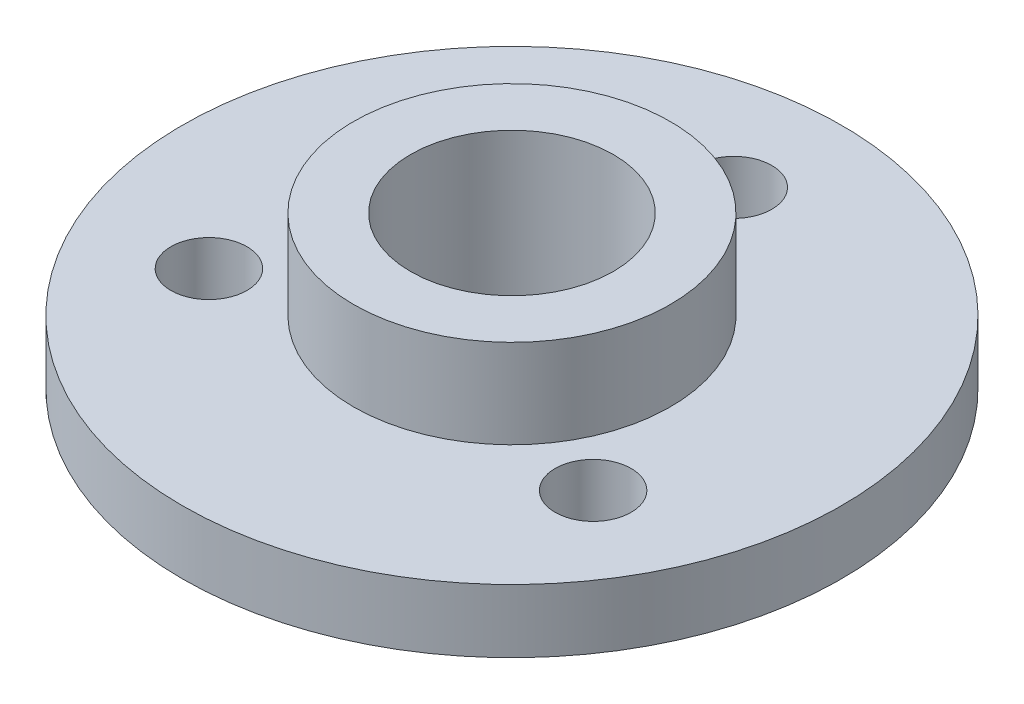
ISO-10303-21;
HEADER;
FILE_DESCRIPTION(('STEP AP214'),'2;1');
FILE_NAME('part.step','',(''),(''),'','','');
FILE_SCHEMA(('AUTOMOTIVE_DESIGN { 1 0 10303 214 1 1 1 1 }'));
ENDSEC;
DATA;
#1=APPLICATION_CONTEXT('core data for automotive mechanical design processes');
#2=APPLICATION_PROTOCOL_DEFINITION('international standard','automotive_design',2000,#1);
#3=PRODUCT_CONTEXT('',#1,'mechanical');
#4=PRODUCT('Part','Part','',(#3));
#5=PRODUCT_RELATED_PRODUCT_CATEGORY('part','',(#4));
#6=PRODUCT_DEFINITION_FORMATION('','',#4);
#7=PRODUCT_DEFINITION_CONTEXT('part definition',#1,'design');
#8=PRODUCT_DEFINITION('design','',#6,#7);
#9=PRODUCT_DEFINITION_SHAPE('','',#8);
#10=(LENGTH_UNIT() NAMED_UNIT(*) SI_UNIT(.MILLI.,.METRE.));
#11=(NAMED_UNIT(*) PLANE_ANGLE_UNIT() SI_UNIT($,.RADIAN.));
#12=(NAMED_UNIT(*) SI_UNIT($,.STERADIAN.) SOLID_ANGLE_UNIT());
#13=UNCERTAINTY_MEASURE_WITH_UNIT(LENGTH_MEASURE(1.E-05),#10,'distance_accuracy_value','');
#14=(GEOMETRIC_REPRESENTATION_CONTEXT(3) GLOBAL_UNCERTAINTY_ASSIGNED_CONTEXT((#13)) GLOBAL_UNIT_ASSIGNED_CONTEXT((#10,
#11,#12)) REPRESENTATION_CONTEXT('',''));
#15=CARTESIAN_POINT('',(0.,0.,0.));
#16=DIRECTION('',(0.,0.,1.));
#17=DIRECTION('',(1.,0.,0.));
#18=AXIS2_PLACEMENT_3D('',#15,#16,#17);
#19=CARTESIAN_POINT('',(0.,5.,0.));
#20=DIRECTION('',(0.,1.,0.));
#21=DIRECTION('',(0.,0.,1.));
#22=AXIS2_PLACEMENT_3D('',#19,#20,#21);
#23=PLANE('',#22);
#24=CARTESIAN_POINT('',(-15.1554445662266,5.,8.75000000000065));
#25=DIRECTION('',(0.,1.,0.));
#26=DIRECTION('',(0.,0.,1.));
#27=AXIS2_PLACEMENT_3D('',#24,#25,#26);
#28=CIRCLE('',#27,3.00000000000142);
#29=CARTESIAN_POINT('',(-15.1554445662266,5.,11.7500000000021));
#30=VERTEX_POINT('',#29);
#31=EDGE_CURVE('E70',#30,#30,#28,.T.);
#32=ORIENTED_EDGE('',*,*,#31,.F.);
#33=EDGE_LOOP('',(#32));
#34=FACE_BOUND('',#33,.T.);
#35=CARTESIAN_POINT('',(15.1554445662288,5.,8.74999999999936));
#36=DIRECTION('',(0.,1.,0.));
#37=DIRECTION('',(0.,0.,1.));
#38=AXIS2_PLACEMENT_3D('',#35,#36,#37);
#39=CIRCLE('',#38,3.00000000000096);
#40=CARTESIAN_POINT('',(15.1554445662288,5.,11.7500000000003));
#41=VERTEX_POINT('',#40);
#42=EDGE_CURVE('E64',#41,#41,#39,.T.);
#43=ORIENTED_EDGE('',*,*,#42,.F.);
#44=EDGE_LOOP('',(#43));
#45=FACE_BOUND('',#44,.T.);
#46=CARTESIAN_POINT('',(0.,5.,-17.5));
#47=DIRECTION('',(0.,1.,0.));
#48=DIRECTION('',(0.,0.,1.));
#49=AXIS2_PLACEMENT_3D('',#46,#47,#48);
#50=CIRCLE('',#49,3.);
#51=CARTESIAN_POINT('',(0.,5.,-14.5));
#52=VERTEX_POINT('',#51);
#53=EDGE_CURVE('E58',#52,#52,#50,.T.);
#54=ORIENTED_EDGE('',*,*,#53,.F.);
#55=EDGE_LOOP('',(#54));
#56=FACE_BOUND('',#55,.T.);
#57=CARTESIAN_POINT('',(0.,5.,0.));
#58=DIRECTION('',(0.,1.,0.));
#59=DIRECTION('',(0.,0.,1.));
#60=AXIS2_PLACEMENT_3D('',#57,#58,#59);
#61=CIRCLE('',#60,26.);
#62=CARTESIAN_POINT('',(0.,5.,26.));
#63=VERTEX_POINT('',#62);
#64=EDGE_CURVE('E10',#63,#63,#61,.T.);
#65=ORIENTED_EDGE('',*,*,#64,.T.);
#66=EDGE_LOOP('',(#65));
#67=FACE_BOUND('',#66,.T.);
#68=CARTESIAN_POINT('',(0.,5.,0.));
#69=DIRECTION('',(0.,1.,0.));
#70=DIRECTION('',(0.,0.,1.));
#71=AXIS2_PLACEMENT_3D('',#68,#69,#70);
#72=CIRCLE('',#71,12.5);
#73=CARTESIAN_POINT('',(0.,5.,12.5));
#74=VERTEX_POINT('',#73);
#75=EDGE_CURVE('E46',#74,#74,#72,.T.);
#76=ORIENTED_EDGE('',*,*,#75,.F.);
#77=EDGE_LOOP('',(#76));
#78=FACE_BOUND('',#77,.T.);
#79=ADVANCED_FACE('F33',(#34,#45,#56,#67,#78),#23,.T.);
#80=CARTESIAN_POINT('',(0.,5.,0.));
#81=DIRECTION('',(0.,-1.,0.));
#82=DIRECTION('',(0.,0.,-1.));
#83=AXIS2_PLACEMENT_3D('',#80,#81,#82);
#84=CYLINDRICAL_SURFACE('',#83,26.);
#85=ORIENTED_EDGE('',*,*,#64,.F.);
#86=EDGE_LOOP('',(#85));
#87=FACE_BOUND('',#86,.T.);
#88=CARTESIAN_POINT('',(0.,0.,0.));
#89=DIRECTION('',(0.,1.,0.));
#90=DIRECTION('',(0.,0.,1.));
#91=AXIS2_PLACEMENT_3D('',#88,#89,#90);
#92=CIRCLE('',#91,26.);
#93=CARTESIAN_POINT('',(0.,0.,26.));
#94=VERTEX_POINT('',#93);
#95=EDGE_CURVE('E37',#94,#94,#92,.T.);
#96=ORIENTED_EDGE('',*,*,#95,.T.);
#97=EDGE_LOOP('',(#96));
#98=FACE_BOUND('',#97,.T.);
#99=ADVANCED_FACE('F35',(#87,#98),#84,.T.);
#100=CARTESIAN_POINT('',(0.,0.,0.));
#101=DIRECTION('',(0.,1.,0.));
#102=DIRECTION('',(0.,0.,1.));
#103=AXIS2_PLACEMENT_3D('',#100,#101,#102);
#104=PLANE('',#103);
#105=CARTESIAN_POINT('',(-15.1554445662266,0.,8.75000000000065));
#106=DIRECTION('',(0.,1.,0.));
#107=DIRECTION('',(0.,0.,1.));
#108=AXIS2_PLACEMENT_3D('',#105,#106,#107);
#109=CIRCLE('',#108,3.00000000000142);
#110=CARTESIAN_POINT('',(-15.1554445662266,0.,11.7500000000021));
#111=VERTEX_POINT('',#110);
#112=EDGE_CURVE('E67',#111,#111,#109,.T.);
#113=ORIENTED_EDGE('',*,*,#112,.T.);
#114=EDGE_LOOP('',(#113));
#115=FACE_BOUND('',#114,.T.);
#116=CARTESIAN_POINT('',(15.1554445662288,0.,8.74999999999936));
#117=DIRECTION('',(0.,1.,0.));
#118=DIRECTION('',(0.,0.,1.));
#119=AXIS2_PLACEMENT_3D('',#116,#117,#118);
#120=CIRCLE('',#119,3.00000000000096);
#121=CARTESIAN_POINT('',(15.1554445662288,0.,11.7500000000003));
#122=VERTEX_POINT('',#121);
#123=EDGE_CURVE('E61',#122,#122,#120,.T.);
#124=ORIENTED_EDGE('',*,*,#123,.T.);
#125=EDGE_LOOP('',(#124));
#126=FACE_BOUND('',#125,.T.);
#127=CARTESIAN_POINT('',(0.,0.,-17.5));
#128=DIRECTION('',(0.,1.,0.));
#129=DIRECTION('',(0.,0.,1.));
#130=AXIS2_PLACEMENT_3D('',#127,#128,#129);
#131=CIRCLE('',#130,3.);
#132=CARTESIAN_POINT('',(0.,0.,-14.5));
#133=VERTEX_POINT('',#132);
#134=EDGE_CURVE('E57',#133,#133,#131,.T.);
#135=ORIENTED_EDGE('',*,*,#134,.T.);
#136=EDGE_LOOP('',(#135));
#137=FACE_BOUND('',#136,.T.);
#138=CARTESIAN_POINT('',(0.,0.,0.));
#139=DIRECTION('',(0.,1.,0.));
#140=DIRECTION('',(0.,0.,1.));
#141=AXIS2_PLACEMENT_3D('',#138,#139,#140);
#142=CIRCLE('',#141,8.);
#143=CARTESIAN_POINT('',(0.,0.,8.));
#144=VERTEX_POINT('',#143);
#145=EDGE_CURVE('E54',#144,#144,#142,.T.);
#146=ORIENTED_EDGE('',*,*,#145,.T.);
#147=EDGE_LOOP('',(#146));
#148=FACE_BOUND('',#147,.T.);
#149=ORIENTED_EDGE('',*,*,#95,.F.);
#150=EDGE_LOOP('',(#149));
#151=FACE_BOUND('',#150,.T.);
#152=ADVANCED_FACE('F76',(#115,#126,#137,#148,#151),#104,.F.);
#153=CARTESIAN_POINT('',(0.,12.,0.));
#154=DIRECTION('',(0.,1.,0.));
#155=DIRECTION('',(0.,0.,1.));
#156=AXIS2_PLACEMENT_3D('',#153,#154,#155);
#157=PLANE('',#156);
#158=CARTESIAN_POINT('',(0.,12.,0.));
#159=DIRECTION('',(0.,1.,0.));
#160=DIRECTION('',(0.,0.,1.));
#161=AXIS2_PLACEMENT_3D('',#158,#159,#160);
#162=CIRCLE('',#161,12.5);
#163=CARTESIAN_POINT('',(0.,12.,12.5));
#164=VERTEX_POINT('',#163);
#165=EDGE_CURVE('E44',#164,#164,#162,.T.);
#166=ORIENTED_EDGE('',*,*,#165,.T.);
#167=EDGE_LOOP('',(#166));
#168=FACE_BOUND('',#167,.T.);
#169=CARTESIAN_POINT('',(0.,12.,0.));
#170=DIRECTION('',(0.,1.,0.));
#171=DIRECTION('',(0.,0.,1.));
#172=AXIS2_PLACEMENT_3D('',#169,#170,#171);
#173=CIRCLE('',#172,8.);
#174=CARTESIAN_POINT('',(0.,12.,8.));
#175=VERTEX_POINT('',#174);
#176=EDGE_CURVE('E49',#175,#175,#173,.T.);
#177=ORIENTED_EDGE('',*,*,#176,.F.);
#178=EDGE_LOOP('',(#177));
#179=FACE_BOUND('',#178,.T.);
#180=ADVANCED_FACE('F98',(#168,#179),#157,.T.);
#181=CARTESIAN_POINT('',(0.,12.,0.));
#182=DIRECTION('',(0.,-1.,0.));
#183=DIRECTION('',(0.,0.,-1.));
#184=AXIS2_PLACEMENT_3D('',#181,#182,#183);
#185=CYLINDRICAL_SURFACE('',#184,12.5);
#186=ORIENTED_EDGE('',*,*,#165,.F.);
#187=EDGE_LOOP('',(#186));
#188=FACE_BOUND('',#187,.T.);
#189=ORIENTED_EDGE('',*,*,#75,.T.);
#190=EDGE_LOOP('',(#189));
#191=FACE_BOUND('',#190,.T.);
#192=ADVANCED_FACE('F95',(#188,#191),#185,.T.);
#193=CARTESIAN_POINT('',(0.,12.,0.));
#194=DIRECTION('',(0.,-1.,0.));
#195=DIRECTION('',(0.,0.,-1.));
#196=AXIS2_PLACEMENT_3D('',#193,#194,#195);
#197=CYLINDRICAL_SURFACE('',#196,8.);
#198=ORIENTED_EDGE('',*,*,#176,.T.);
#199=EDGE_LOOP('',(#198));
#200=FACE_BOUND('',#199,.T.);
#201=ORIENTED_EDGE('',*,*,#145,.F.);
#202=EDGE_LOOP('',(#201));
#203=FACE_BOUND('',#202,.T.);
#204=ADVANCED_FACE('F97',(#200,#203),#197,.F.);
#205=CARTESIAN_POINT('',(0.,0.,-17.5));
#206=DIRECTION('',(0.,1.,0.));
#207=DIRECTION('',(0.,0.,1.));
#208=AXIS2_PLACEMENT_3D('',#205,#206,#207);
#209=CYLINDRICAL_SURFACE('',#208,3.);
#210=ORIENTED_EDGE('',*,*,#134,.F.);
#211=EDGE_LOOP('',(#210));
#212=FACE_BOUND('',#211,.T.);
#213=ORIENTED_EDGE('',*,*,#53,.T.);
#214=EDGE_LOOP('',(#213));
#215=FACE_BOUND('',#214,.T.);
#216=ADVANCED_FACE('F105',(#212,#215),#209,.F.);
#217=CARTESIAN_POINT('',(15.1554445662288,0.,8.74999999999936));
#218=DIRECTION('',(0.,1.,0.));
#219=DIRECTION('',(0.,0.,1.));
#220=AXIS2_PLACEMENT_3D('',#217,#218,#219);
#221=CYLINDRICAL_SURFACE('',#220,3.00000000000096);
#222=ORIENTED_EDGE('',*,*,#123,.F.);
#223=EDGE_LOOP('',(#222));
#224=FACE_BOUND('',#223,.T.);
#225=ORIENTED_EDGE('',*,*,#42,.T.);
#226=EDGE_LOOP('',(#225));
#227=FACE_BOUND('',#226,.T.);
#228=ADVANCED_FACE('F82',(#224,#227),#221,.F.);
#229=CARTESIAN_POINT('',(-15.1554445662266,0.,8.75000000000065));
#230=DIRECTION('',(0.,1.,0.));
#231=DIRECTION('',(0.,0.,1.));
#232=AXIS2_PLACEMENT_3D('',#229,#230,#231);
#233=CYLINDRICAL_SURFACE('',#232,3.00000000000142);
#234=ORIENTED_EDGE('',*,*,#112,.F.);
#235=EDGE_LOOP('',(#234));
#236=FACE_BOUND('',#235,.T.);
#237=ORIENTED_EDGE('',*,*,#31,.T.);
#238=EDGE_LOOP('',(#237));
#239=FACE_BOUND('',#238,.T.);
#240=ADVANCED_FACE('F79',(#236,#239),#233,.F.);
#241=CLOSED_SHELL('',(#79,#99,#152,#180,#192,#204,#216,#228,#240));
#242=MANIFOLD_SOLID_BREP('B2',#241);
#243=ADVANCED_BREP_SHAPE_REPRESENTATION('',(#18,#242),#14);
#244=SHAPE_DEFINITION_REPRESENTATION(#9,#243);
ENDSEC;
END-ISO-10303-21;
